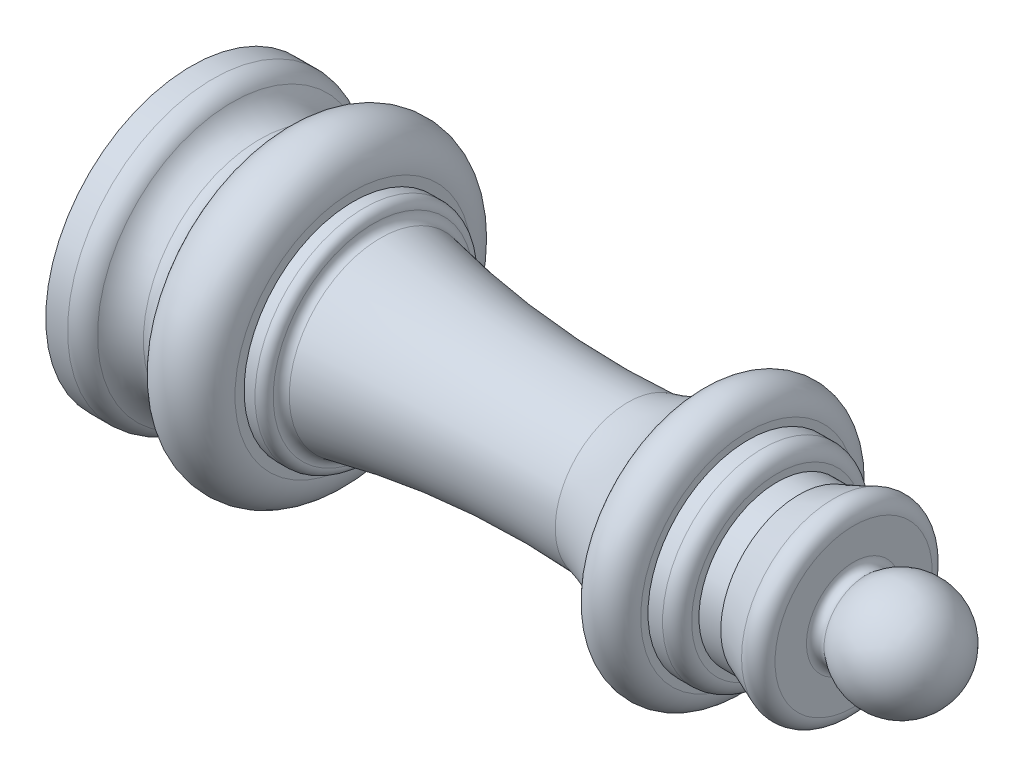
ISO-10303-21;
HEADER;
FILE_DESCRIPTION(('STEP AP214'),'2;1');
FILE_NAME('part.step','',(''),(''),'','','');
FILE_SCHEMA(('AUTOMOTIVE_DESIGN { 1 0 10303 214 1 1 1 1 }'));
ENDSEC;
DATA;
#1=APPLICATION_CONTEXT('core data for automotive mechanical design processes');
#2=APPLICATION_PROTOCOL_DEFINITION('international standard','automotive_design',2000,#1);
#3=PRODUCT_CONTEXT('',#1,'mechanical');
#4=PRODUCT('Part','Part','',(#3));
#5=PRODUCT_RELATED_PRODUCT_CATEGORY('part','',(#4));
#6=PRODUCT_DEFINITION_FORMATION('','',#4);
#7=PRODUCT_DEFINITION_CONTEXT('part definition',#1,'design');
#8=PRODUCT_DEFINITION('design','',#6,#7);
#9=PRODUCT_DEFINITION_SHAPE('','',#8);
#10=(LENGTH_UNIT() NAMED_UNIT(*) SI_UNIT(.MILLI.,.METRE.));
#11=(NAMED_UNIT(*) PLANE_ANGLE_UNIT() SI_UNIT($,.RADIAN.));
#12=(NAMED_UNIT(*) SI_UNIT($,.STERADIAN.) SOLID_ANGLE_UNIT());
#13=UNCERTAINTY_MEASURE_WITH_UNIT(LENGTH_MEASURE(1.E-05),#10,'distance_accuracy_value','');
#14=(GEOMETRIC_REPRESENTATION_CONTEXT(3) GLOBAL_UNCERTAINTY_ASSIGNED_CONTEXT((#13)) GLOBAL_UNIT_ASSIGNED_CONTEXT((#10,
#11,#12)) REPRESENTATION_CONTEXT('',''));
#15=CARTESIAN_POINT('',(0.,0.,0.));
#16=DIRECTION('',(0.,0.,1.));
#17=DIRECTION('',(1.,0.,0.));
#18=AXIS2_PLACEMENT_3D('',#15,#16,#17);
#19=CARTESIAN_POINT('',(-7.5,0.,0.));
#20=DIRECTION('',(1.,0.,0.));
#21=DIRECTION('',(0.,1.,0.));
#22=AXIS2_PLACEMENT_3D('',#19,#20,#21);
#23=SPHERICAL_SURFACE('',#22,7.5);
#24=CARTESIAN_POINT('',(-12.3606894063151,0.,0.));
#25=DIRECTION('',(1.,0.,0.));
#26=DIRECTION('',(0.,0.,-1.));
#27=AXIS2_PLACEMENT_3D('',#24,#25,#26);
#28=CIRCLE('',#27,5.71171589763849);
#29=CARTESIAN_POINT('',(-12.3606894063151,0.,-5.71171589763849));
#30=VERTEX_POINT('',#29);
#31=EDGE_CURVE('E59',#30,#30,#28,.T.);
#32=ORIENTED_EDGE('',*,*,#31,.T.);
#33=EDGE_LOOP('',(#32));
#34=FACE_BOUND('',#33,.T.);
#35=ADVANCED_FACE('F33',(#34),#23,.T.);
#36=CARTESIAN_POINT('',(-13.0087813271571,0.,0.));
#37=DIRECTION('',(1.,0.,0.));
#38=DIRECTION('',(0.,0.,-1.));
#39=AXIS2_PLACEMENT_3D('',#36,#37,#38);
#40=TOROIDAL_SURFACE('',#39,6.47327801732363,1.);
#41=CARTESIAN_POINT('',(-14.0087813271571,0.,0.));
#42=DIRECTION('',(1.,0.,0.));
#43=DIRECTION('',(0.,0.,-1.));
#44=AXIS2_PLACEMENT_3D('',#41,#42,#43);
#45=CIRCLE('',#44,6.47327801732363);
#46=CARTESIAN_POINT('',(-14.0087813271571,0.,-6.47327801732363));
#47=VERTEX_POINT('',#46);
#48=EDGE_CURVE('E62',#47,#47,#45,.T.);
#49=ORIENTED_EDGE('',*,*,#48,.T.);
#50=EDGE_LOOP('',(#49));
#51=FACE_BOUND('',#50,.T.);
#52=ORIENTED_EDGE('',*,*,#31,.F.);
#53=EDGE_LOOP('',(#52));
#54=FACE_BOUND('',#53,.T.);
#55=ADVANCED_FACE('F128',(#51,#54),#40,.F.);
#56=CARTESIAN_POINT('',(-14.0087813271571,6.47327801732363,0.));
#57=DIRECTION('',(1.,0.,0.));
#58=DIRECTION('',(0.,0.,-1.));
#59=AXIS2_PLACEMENT_3D('',#56,#57,#58);
#60=PLANE('',#59);
#61=CARTESIAN_POINT('',(-14.0087813271571,0.,0.));
#62=DIRECTION('',(1.,0.,0.));
#63=DIRECTION('',(0.,0.,-1.));
#64=AXIS2_PLACEMENT_3D('',#61,#62,#63);
#65=CIRCLE('',#64,10.7959340771462);
#66=CARTESIAN_POINT('',(-14.0087813271571,0.,-10.7959340771462));
#67=VERTEX_POINT('',#66);
#68=EDGE_CURVE('E40',#67,#67,#65,.T.);
#69=ORIENTED_EDGE('',*,*,#68,.T.);
#70=EDGE_LOOP('',(#69));
#71=FACE_BOUND('',#70,.T.);
#72=ORIENTED_EDGE('',*,*,#48,.F.);
#73=EDGE_LOOP('',(#72));
#74=FACE_BOUND('',#73,.T.);
#75=ADVANCED_FACE('F134',(#71,#74),#60,.T.);
#76=CARTESIAN_POINT('',(-14.0087813271571,0.,0.));
#77=DIRECTION('',(1.,0.,0.));
#78=DIRECTION('',(0.,0.,-1.));
#79=AXIS2_PLACEMENT_3D('',#76,#77,#78);
#80=CONICAL_SURFACE('',#79,13.75,0.380506377112365);
#81=CARTESIAN_POINT('',(-16.7515626798653,0.,0.));
#82=DIRECTION('',(-1.,0.,0.));
#83=DIRECTION('',(0.,0.,1.));
#84=AXIS2_PLACEMENT_3D('',#81,#82,#83);
#85=CIRCLE('',#84,12.6528874589167);
#86=CARTESIAN_POINT('',(-16.7515626798653,0.,12.6528874589167));
#87=VERTEX_POINT('',#86);
#88=EDGE_CURVE('E10',#87,#87,#85,.T.);
#89=ORIENTED_EDGE('',*,*,#88,.T.);
#90=EDGE_LOOP('',(#89));
#91=FACE_BOUND('',#90,.T.);
#92=CARTESIAN_POINT('',(-21.5087813271571,0.,0.));
#93=DIRECTION('',(1.,0.,0.));
#94=DIRECTION('',(0.,0.,-1.));
#95=AXIS2_PLACEMENT_3D('',#92,#93,#94);
#96=CIRCLE('',#95,10.75);
#97=CARTESIAN_POINT('',(-21.5087813271571,0.,-10.75));
#98=VERTEX_POINT('',#97);
#99=EDGE_CURVE('E65',#98,#98,#96,.T.);
#100=ORIENTED_EDGE('',*,*,#99,.T.);
#101=EDGE_LOOP('',(#100));
#102=FACE_BOUND('',#101,.T.);
#103=ADVANCED_FACE('F158',(#91,#102),#80,.T.);
#104=CARTESIAN_POINT('',(0.,0.,0.));
#105=DIRECTION('',(1.,0.,0.));
#106=DIRECTION('',(0.,0.,-1.));
#107=AXIS2_PLACEMENT_3D('',#104,#105,#106);
#108=CYLINDRICAL_SURFACE('',#107,10.75);
#109=CARTESIAN_POINT('',(-24.5087813271571,0.,0.));
#110=DIRECTION('',(1.,0.,0.));
#111=DIRECTION('',(0.,0.,-1.));
#112=AXIS2_PLACEMENT_3D('',#109,#110,#111);
#113=CIRCLE('',#112,10.75);
#114=CARTESIAN_POINT('',(-24.5087813271571,0.,-10.75));
#115=VERTEX_POINT('',#114);
#116=EDGE_CURVE('E68',#115,#115,#113,.T.);
#117=ORIENTED_EDGE('',*,*,#116,.T.);
#118=EDGE_LOOP('',(#117));
#119=FACE_BOUND('',#118,.T.);
#120=ORIENTED_EDGE('',*,*,#99,.F.);
#121=EDGE_LOOP('',(#120));
#122=FACE_BOUND('',#121,.T.);
#123=ADVANCED_FACE('F152',(#119,#122),#108,.T.);
#124=CARTESIAN_POINT('',(-24.5087813271571,10.75,0.));
#125=DIRECTION('',(1.,0.,0.));
#126=DIRECTION('',(0.,0.,-1.));
#127=AXIS2_PLACEMENT_3D('',#124,#125,#126);
#128=PLANE('',#127);
#129=CARTESIAN_POINT('',(-24.5087813271571,0.,0.));
#130=DIRECTION('',(1.,0.,0.));
#131=DIRECTION('',(0.,0.,-1.));
#132=AXIS2_PLACEMENT_3D('',#129,#130,#131);
#133=CIRCLE('',#132,11.75);
#134=CARTESIAN_POINT('',(-24.5087813271571,0.,-11.75));
#135=VERTEX_POINT('',#134);
#136=EDGE_CURVE('E48',#135,#135,#133,.T.);
#137=ORIENTED_EDGE('',*,*,#136,.T.);
#138=EDGE_LOOP('',(#137));
#139=FACE_BOUND('',#138,.T.);
#140=ORIENTED_EDGE('',*,*,#116,.F.);
#141=EDGE_LOOP('',(#140));
#142=FACE_BOUND('',#141,.T.);
#143=ADVANCED_FACE('F148',(#139,#142),#128,.T.);
#144=CARTESIAN_POINT('',(0.,0.,0.));
#145=DIRECTION('',(1.,0.,0.));
#146=DIRECTION('',(0.,0.,-1.));
#147=AXIS2_PLACEMENT_3D('',#144,#145,#146);
#148=CYLINDRICAL_SURFACE('',#147,13.75);
#149=CARTESIAN_POINT('',(-26.5087813271571,0.,0.));
#150=DIRECTION('',(1.,0.,0.));
#151=DIRECTION('',(0.,0.,-1.));
#152=AXIS2_PLACEMENT_3D('',#149,#150,#151);
#153=CIRCLE('',#152,13.75);
#154=CARTESIAN_POINT('',(-26.5087813271571,0.,-13.75));
#155=VERTEX_POINT('',#154);
#156=EDGE_CURVE('E44',#155,#155,#153,.F.);
#157=ORIENTED_EDGE('',*,*,#156,.T.);
#158=EDGE_LOOP('',(#157));
#159=FACE_BOUND('',#158,.T.);
#160=CARTESIAN_POINT('',(-28.5087813271571,0.,0.));
#161=DIRECTION('',(1.,0.,0.));
#162=DIRECTION('',(0.,0.,-1.));
#163=AXIS2_PLACEMENT_3D('',#160,#161,#162);
#164=CIRCLE('',#163,13.75);
#165=CARTESIAN_POINT('',(-28.5087813271571,0.,-13.75));
#166=VERTEX_POINT('',#165);
#167=EDGE_CURVE('E71',#166,#166,#164,.T.);
#168=ORIENTED_EDGE('',*,*,#167,.T.);
#169=EDGE_LOOP('',(#168));
#170=FACE_BOUND('',#169,.T.);
#171=ADVANCED_FACE('F151',(#159,#170),#148,.T.);
#172=CARTESIAN_POINT('',(-28.5087813271571,13.75,0.));
#173=DIRECTION('',(1.,0.,0.));
#174=DIRECTION('',(0.,0.,-1.));
#175=AXIS2_PLACEMENT_3D('',#172,#173,#174);
#176=PLANE('',#175);
#177=CARTESIAN_POINT('',(-28.5087813271571,0.,0.));
#178=DIRECTION('',(1.,0.,0.));
#179=DIRECTION('',(0.,0.,-1.));
#180=AXIS2_PLACEMENT_3D('',#177,#178,#179);
#181=CIRCLE('',#180,14.75);
#182=CARTESIAN_POINT('',(-28.5087813271571,0.,-14.75));
#183=VERTEX_POINT('',#182);
#184=EDGE_CURVE('E74',#183,#183,#181,.T.);
#185=ORIENTED_EDGE('',*,*,#184,.T.);
#186=EDGE_LOOP('',(#185));
#187=FACE_BOUND('',#186,.T.);
#188=ORIENTED_EDGE('',*,*,#167,.F.);
#189=EDGE_LOOP('',(#188));
#190=FACE_BOUND('',#189,.T.);
#191=ADVANCED_FACE('F170',(#187,#190),#176,.T.);
#192=CARTESIAN_POINT('',(-32.0000007139932,0.,0.));
#193=DIRECTION('',(1.,0.,0.));
#194=DIRECTION('',(0.,0.,-1.));
#195=AXIS2_PLACEMENT_3D('',#192,#193,#194);
#196=TOROIDAL_SURFACE('',#195,14.5022356099442,3.5);
#197=CARTESIAN_POINT('',(-35.4316530808885,0.,0.));
#198=DIRECTION('',(1.,0.,0.));
#199=DIRECTION('',(0.,0.,-1.));
#200=AXIS2_PLACEMENT_3D('',#197,#198,#199);
#201=CIRCLE('',#200,15.1905393457928);
#202=CARTESIAN_POINT('',(-35.4316530808885,0.,-15.1905393457928));
#203=VERTEX_POINT('',#202);
#204=EDGE_CURVE('E56',#203,#203,#201,.T.);
#205=ORIENTED_EDGE('',*,*,#204,.T.);
#206=EDGE_LOOP('',(#205));
#207=FACE_BOUND('',#206,.T.);
#208=ORIENTED_EDGE('',*,*,#184,.F.);
#209=EDGE_LOOP('',(#208));
#210=FACE_BOUND('',#209,.T.);
#211=ADVANCED_FACE('F174',(#207,#210),#196,.T.);
#212=CARTESIAN_POINT('',(-50.4939282314384,0.,0.));
#213=DIRECTION('',(1.,0.,0.));
#214=DIRECTION('',(0.,0.,-1.));
#215=AXIS2_PLACEMENT_3D('',#212,#213,#214);
#216=TOROIDAL_SURFACE('',#215,33.8760707108143,24.5);
#217=CARTESIAN_POINT('',(-36.2280345402408,0.,0.));
#218=DIRECTION('',(-1.,0.,0.));
#219=DIRECTION('',(0.,0.,1.));
#220=AXIS2_PLACEMENT_3D('',#217,#218,#219);
#221=CIRCLE('',#220,13.9578811045411);
#222=CARTESIAN_POINT('',(-36.2280345402408,0.,13.9578811045411));
#223=VERTEX_POINT('',#222);
#224=EDGE_CURVE('E53',#223,#223,#221,.T.);
#225=ORIENTED_EDGE('',*,*,#224,.T.);
#226=EDGE_LOOP('',(#225));
#227=FACE_BOUND('',#226,.T.);
#228=CARTESIAN_POINT('',(-45.,0.,0.));
#229=DIRECTION('',(1.,0.,0.));
#230=DIRECTION('',(0.,0.,-1.));
#231=AXIS2_PLACEMENT_3D('',#228,#229,#230);
#232=CIRCLE('',#231,9.99999999999999);
#233=CARTESIAN_POINT('',(-45.,0.,-9.99999999999999));
#234=VERTEX_POINT('',#233);
#235=EDGE_CURVE('E77',#234,#234,#232,.T.);
#236=ORIENTED_EDGE('',*,*,#235,.T.);
#237=EDGE_LOOP('',(#236));
#238=FACE_BOUND('',#237,.T.);
#239=ADVANCED_FACE('F178',(#227,#238),#216,.F.);
#240=CARTESIAN_POINT('',(-52.8281884760565,0.,0.));
#241=DIRECTION('',(1.,0.,0.));
#242=DIRECTION('',(0.,0.,-1.));
#243=AXIS2_PLACEMENT_3D('',#240,#241,#242);
#244=TOROIDAL_SURFACE('',#243,134.754637048822,125.);
#245=CARTESIAN_POINT('',(-79.0118364800399,0.,0.));
#246=DIRECTION('',(1.,0.,0.));
#247=DIRECTION('',(0.,0.,-1.));
#248=AXIS2_PLACEMENT_3D('',#245,#246,#247);
#249=CIRCLE('',#248,12.5277309389009);
#250=CARTESIAN_POINT('',(-79.0118364800399,0.,-12.5277309389009));
#251=VERTEX_POINT('',#250);
#252=EDGE_CURVE('E80',#251,#251,#249,.T.);
#253=ORIENTED_EDGE('',*,*,#252,.T.);
#254=EDGE_LOOP('',(#253));
#255=FACE_BOUND('',#254,.T.);
#256=ORIENTED_EDGE('',*,*,#235,.F.);
#257=EDGE_LOOP('',(#256));
#258=FACE_BOUND('',#257,.T.);
#259=ADVANCED_FACE('F182',(#255,#258),#244,.F.);
#260=CARTESIAN_POINT('',(-78.7500000000001,0.,0.));
#261=DIRECTION('',(1.,0.,0.));
#262=DIRECTION('',(0.,0.,-1.));
#263=AXIS2_PLACEMENT_3D('',#260,#261,#262);
#264=TOROIDAL_SURFACE('',#263,13.75,1.24999999999992);
#265=CARTESIAN_POINT('',(-79.9999999859731,0.,0.));
#266=DIRECTION('',(1.,0.,0.));
#267=DIRECTION('',(0.,0.,-1.));
#268=AXIS2_PLACEMENT_3D('',#265,#266,#267);
#269=CIRCLE('',#268,13.749999985973);
#270=CARTESIAN_POINT('',(-79.9999999859731,0.,-13.749999985973));
#271=VERTEX_POINT('',#270);
#272=EDGE_CURVE('E83',#271,#271,#269,.T.);
#273=ORIENTED_EDGE('',*,*,#272,.T.);
#274=EDGE_LOOP('',(#273));
#275=FACE_BOUND('',#274,.T.);
#276=ORIENTED_EDGE('',*,*,#252,.F.);
#277=EDGE_LOOP('',(#276));
#278=FACE_BOUND('',#277,.T.);
#279=ADVANCED_FACE('F186',(#275,#278),#264,.F.);
#280=CARTESIAN_POINT('',(-81.25,0.,0.));
#281=DIRECTION('',(1.,0.,0.));
#282=DIRECTION('',(0.,0.,-1.));
#283=AXIS2_PLACEMENT_3D('',#280,#281,#282);
#284=TOROIDAL_SURFACE('',#283,13.7499999719461,1.25000001402695);
#285=CARTESIAN_POINT('',(-81.2499999674095,0.,0.));
#286=DIRECTION('',(1.,0.,0.));
#287=DIRECTION('',(0.,0.,-1.));
#288=AXIS2_PLACEMENT_3D('',#285,#286,#287);
#289=CIRCLE('',#288,15.);
#290=CARTESIAN_POINT('',(-81.2499999674095,0.,-15.));
#291=VERTEX_POINT('',#290);
#292=EDGE_CURVE('E86',#291,#291,#289,.T.);
#293=ORIENTED_EDGE('',*,*,#292,.T.);
#294=EDGE_LOOP('',(#293));
#295=FACE_BOUND('',#294,.T.);
#296=ORIENTED_EDGE('',*,*,#272,.F.);
#297=EDGE_LOOP('',(#296));
#298=FACE_BOUND('',#297,.T.);
#299=ADVANCED_FACE('F190',(#295,#298),#284,.T.);
#300=CARTESIAN_POINT('',(0.,0.,0.));
#301=DIRECTION('',(1.,0.,0.));
#302=DIRECTION('',(0.,0.,-1.));
#303=AXIS2_PLACEMENT_3D('',#300,#301,#302);
#304=CYLINDRICAL_SURFACE('',#303,15.);
#305=CARTESIAN_POINT('',(-82.7499999674095,0.,0.));
#306=DIRECTION('',(1.,0.,0.));
#307=DIRECTION('',(0.,0.,-1.));
#308=AXIS2_PLACEMENT_3D('',#305,#306,#307);
#309=CIRCLE('',#308,15.);
#310=CARTESIAN_POINT('',(-82.7499999674095,0.,-15.));
#311=VERTEX_POINT('',#310);
#312=EDGE_CURVE('E89',#311,#311,#309,.T.);
#313=ORIENTED_EDGE('',*,*,#312,.T.);
#314=EDGE_LOOP('',(#313));
#315=FACE_BOUND('',#314,.T.);
#316=ORIENTED_EDGE('',*,*,#292,.F.);
#317=EDGE_LOOP('',(#316));
#318=FACE_BOUND('',#317,.T.);
#319=ADVANCED_FACE('F194',(#315,#318),#304,.T.);
#320=CARTESIAN_POINT('',(-82.7499999714049,15.,0.));
#321=DIRECTION('',(1.,0.,0.));
#322=DIRECTION('',(0.,0.,-1.));
#323=AXIS2_PLACEMENT_3D('',#320,#321,#322);
#324=PLANE('',#323);
#325=CARTESIAN_POINT('',(-82.7499999754004,0.,0.));
#326=DIRECTION('',(1.,0.,0.));
#327=DIRECTION('',(0.,0.,-1.));
#328=AXIS2_PLACEMENT_3D('',#325,#326,#327);
#329=CIRCLE('',#328,16.25);
#330=CARTESIAN_POINT('',(-82.7499999754004,0.,-16.25));
#331=VERTEX_POINT('',#330);
#332=EDGE_CURVE('E92',#331,#331,#329,.T.);
#333=ORIENTED_EDGE('',*,*,#332,.T.);
#334=EDGE_LOOP('',(#333));
#335=FACE_BOUND('',#334,.T.);
#336=ORIENTED_EDGE('',*,*,#312,.F.);
#337=EDGE_LOOP('',(#336));
#338=FACE_BOUND('',#337,.T.);
#339=ADVANCED_FACE('F198',(#335,#338),#324,.T.);
#340=CARTESIAN_POINT('',(-87.7499999674095,0.,0.));
#341=DIRECTION('',(1.,0.,0.));
#342=DIRECTION('',(0.,0.,-1.));
#343=AXIS2_PLACEMENT_3D('',#340,#341,#342);
#344=TOROIDAL_SURFACE('',#343,16.25,4.99999999200906);
#345=CARTESIAN_POINT('',(-92.4492076163472,0.,0.));
#346=DIRECTION('',(1.,0.,0.));
#347=DIRECTION('',(0.,0.,-1.));
#348=AXIS2_PLACEMENT_3D('',#345,#346,#347);
#349=CIRCLE('',#348,17.9580536230321);
#350=CARTESIAN_POINT('',(-92.4492076163472,0.,-17.9580536230321));
#351=VERTEX_POINT('',#350);
#352=EDGE_CURVE('E95',#351,#351,#349,.T.);
#353=ORIENTED_EDGE('',*,*,#352,.T.);
#354=EDGE_LOOP('',(#353));
#355=FACE_BOUND('',#354,.T.);
#356=ORIENTED_EDGE('',*,*,#332,.F.);
#357=EDGE_LOOP('',(#356));
#358=FACE_BOUND('',#357,.T.);
#359=ADVANCED_FACE('F202',(#355,#358),#344,.T.);
#360=CARTESIAN_POINT('',(-95.2687322522224,0.,0.));
#361=DIRECTION('',(1.,0.,0.));
#362=DIRECTION('',(0.,0.,-1.));
#363=AXIS2_PLACEMENT_3D('',#360,#361,#362);
#364=TOROIDAL_SURFACE('',#363,18.9828858137576,3.00000003190909);
#365=CARTESIAN_POINT('',(-95.5887205216157,0.,0.));
#366=DIRECTION('',(1.,0.,0.));
#367=DIRECTION('',(0.,0.,-1.));
#368=AXIS2_PLACEMENT_3D('',#365,#366,#367);
#369=CIRCLE('',#368,16.0000000131824);
#370=CARTESIAN_POINT('',(-95.5887205216157,0.,-16.0000000131824));
#371=VERTEX_POINT('',#370);
#372=EDGE_CURVE('E98',#371,#371,#369,.T.);
#373=ORIENTED_EDGE('',*,*,#372,.T.);
#374=EDGE_LOOP('',(#373));
#375=FACE_BOUND('',#374,.T.);
#376=ORIENTED_EDGE('',*,*,#352,.F.);
#377=EDGE_LOOP('',(#376));
#378=FACE_BOUND('',#377,.T.);
#379=ADVANCED_FACE('F206',(#375,#378),#364,.F.);
#380=CARTESIAN_POINT('',(-95.0554067355804,0.,0.));
#381=DIRECTION('',(1.,0.,0.));
#382=DIRECTION('',(0.,0.,-1.));
#383=AXIS2_PLACEMENT_3D('',#380,#381,#382);
#384=TOROIDAL_SURFACE('',#383,20.9714763820891,5.00000008809733);
#385=CARTESIAN_POINT('',(-99.3957775703984,0.,0.));
#386=DIRECTION('',(1.,0.,0.));
#387=DIRECTION('',(0.,0.,-1.));
#388=AXIS2_PLACEMENT_3D('',#385,#386,#387);
#389=CIRCLE('',#388,18.4893036355414);
#390=CARTESIAN_POINT('',(-99.3957775703984,0.,-18.4893036355414));
#391=VERTEX_POINT('',#390);
#392=EDGE_CURVE('E101',#391,#391,#389,.T.);
#393=ORIENTED_EDGE('',*,*,#392,.T.);
#394=EDGE_LOOP('',(#393));
#395=FACE_BOUND('',#394,.T.);
#396=ORIENTED_EDGE('',*,*,#372,.F.);
#397=EDGE_LOOP('',(#396));
#398=FACE_BOUND('',#397,.T.);
#399=ADVANCED_FACE('F210',(#395,#398),#384,.F.);
#400=CARTESIAN_POINT('',(-102.,0.,0.));
#401=DIRECTION('',(1.,0.,0.));
#402=DIRECTION('',(0.,0.,-1.));
#403=AXIS2_PLACEMENT_3D('',#400,#401,#402);
#404=TOROIDAL_SURFACE('',#403,17.0000000283817,2.99999994952316);
#405=CARTESIAN_POINT('',(-102.,0.,0.));
#406=DIRECTION('',(1.,0.,0.));
#407=DIRECTION('',(0.,0.,-1.));
#408=AXIS2_PLACEMENT_3D('',#405,#406,#407);
#409=CIRCLE('',#408,20.);
#410=CARTESIAN_POINT('',(-102.,0.,-20.));
#411=VERTEX_POINT('',#410);
#412=EDGE_CURVE('E104',#411,#411,#409,.T.);
#413=ORIENTED_EDGE('',*,*,#412,.T.);
#414=EDGE_LOOP('',(#413));
#415=FACE_BOUND('',#414,.T.);
#416=ORIENTED_EDGE('',*,*,#392,.F.);
#417=EDGE_LOOP('',(#416));
#418=FACE_BOUND('',#417,.T.);
#419=ADVANCED_FACE('F125',(#415,#418),#404,.T.);
#420=CARTESIAN_POINT('',(0.,0.,0.));
#421=DIRECTION('',(1.,0.,0.));
#422=DIRECTION('',(0.,0.,-1.));
#423=AXIS2_PLACEMENT_3D('',#420,#421,#422);
#424=CYLINDRICAL_SURFACE('',#423,20.);
#425=CARTESIAN_POINT('',(-105.,0.,0.));
#426=DIRECTION('',(1.,0.,0.));
#427=DIRECTION('',(0.,0.,-1.));
#428=AXIS2_PLACEMENT_3D('',#425,#426,#427);
#429=CIRCLE('',#428,20.);
#430=CARTESIAN_POINT('',(-105.,0.,-20.));
#431=VERTEX_POINT('',#430);
#432=EDGE_CURVE('E107',#431,#431,#429,.T.);
#433=ORIENTED_EDGE('',*,*,#432,.T.);
#434=EDGE_LOOP('',(#433));
#435=FACE_BOUND('',#434,.T.);
#436=ORIENTED_EDGE('',*,*,#412,.F.);
#437=EDGE_LOOP('',(#436));
#438=FACE_BOUND('',#437,.T.);
#439=ADVANCED_FACE('F111',(#435,#438),#424,.T.);
#440=CARTESIAN_POINT('',(-105.,0.,0.));
#441=DIRECTION('',(-1.,0.,0.));
#442=DIRECTION('',(0.,0.,1.));
#443=AXIS2_PLACEMENT_3D('',#440,#441,#442);
#444=PLANE('',#443);
#445=ORIENTED_EDGE('',*,*,#432,.F.);
#446=EDGE_LOOP('',(#445));
#447=FACE_BOUND('',#446,.T.);
#448=ADVANCED_FACE('F114',(#447),#444,.T.);
#449=CARTESIAN_POINT('',(-37.3925972905427,0.,0.));
#450=DIRECTION('',(1.,0.,0.));
#451=DIRECTION('',(0.,0.,-1.));
#452=AXIS2_PLACEMENT_3D('',#449,#450,#451);
#453=TOROIDAL_SURFACE('',#452,15.5838557662777,2.);
#454=ORIENTED_EDGE('',*,*,#224,.F.);
#455=EDGE_LOOP('',(#454));
#456=FACE_BOUND('',#455,.T.);
#457=ORIENTED_EDGE('',*,*,#204,.F.);
#458=EDGE_LOOP('',(#457));
#459=FACE_BOUND('',#458,.T.);
#460=ADVANCED_FACE('F116',(#456,#459),#453,.F.);
#461=CARTESIAN_POINT('',(-26.5087813271571,0.,0.));
#462=DIRECTION('',(1.,0.,0.));
#463=DIRECTION('',(0.,0.,-1.));
#464=AXIS2_PLACEMENT_3D('',#461,#462,#463);
#465=TOROIDAL_SURFACE('',#464,11.75,2.);
#466=ORIENTED_EDGE('',*,*,#156,.F.);
#467=EDGE_LOOP('',(#466));
#468=FACE_BOUND('',#467,.T.);
#469=ORIENTED_EDGE('',*,*,#136,.F.);
#470=EDGE_LOOP('',(#469));
#471=FACE_BOUND('',#470,.T.);
#472=ADVANCED_FACE('F122',(#468,#471),#465,.T.);
#473=CARTESIAN_POINT('',(-16.0087813271571,0.,0.));
#474=DIRECTION('',(1.,0.,0.));
#475=DIRECTION('',(0.,0.,-1.));
#476=AXIS2_PLACEMENT_3D('',#473,#474,#475);
#477=TOROIDAL_SURFACE('',#476,10.7959340771462,2.);
#478=ORIENTED_EDGE('',*,*,#88,.F.);
#479=EDGE_LOOP('',(#478));
#480=FACE_BOUND('',#479,.T.);
#481=ORIENTED_EDGE('',*,*,#68,.F.);
#482=EDGE_LOOP('',(#481));
#483=FACE_BOUND('',#482,.T.);
#484=ADVANCED_FACE('F35',(#480,#483),#477,.T.);
#485=CLOSED_SHELL('',(#35,#55,#75,#103,#123,#143,#171,#191,#211,#239,#259,#279,#299,#319,#339,
#359,#379,#399,#419,#439,#448,#460,#472,#484));
#486=MANIFOLD_SOLID_BREP('B2',#485);
#487=ADVANCED_BREP_SHAPE_REPRESENTATION('',(#18,#486),#14);
#488=SHAPE_DEFINITION_REPRESENTATION(#9,#487);
ENDSEC;
END-ISO-10303-21;
